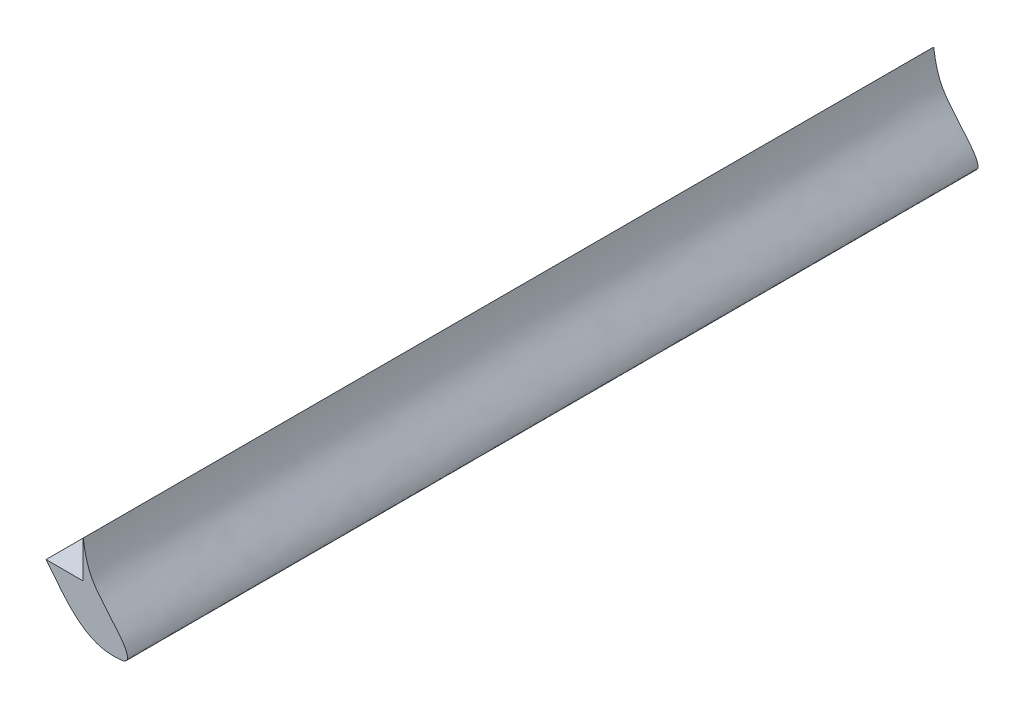
ISO-10303-21;
HEADER;
FILE_DESCRIPTION(('STEP AP214'),'2;1');
FILE_NAME('part.step','',(''),(''),'','','');
FILE_SCHEMA(('AUTOMOTIVE_DESIGN { 1 0 10303 214 1 1 1 1 }'));
ENDSEC;
DATA;
#1=APPLICATION_CONTEXT('core data for automotive mechanical design processes');
#2=APPLICATION_PROTOCOL_DEFINITION('international standard','automotive_design',2000,#1);
#3=PRODUCT_CONTEXT('',#1,'mechanical');
#4=PRODUCT('Part','Part','',(#3));
#5=PRODUCT_RELATED_PRODUCT_CATEGORY('part','',(#4));
#6=PRODUCT_DEFINITION_FORMATION('','',#4);
#7=PRODUCT_DEFINITION_CONTEXT('part definition',#1,'design');
#8=PRODUCT_DEFINITION('design','',#6,#7);
#9=PRODUCT_DEFINITION_SHAPE('','',#8);
#10=(LENGTH_UNIT() NAMED_UNIT(*) SI_UNIT(.MILLI.,.METRE.));
#11=(NAMED_UNIT(*) PLANE_ANGLE_UNIT() SI_UNIT($,.RADIAN.));
#12=(NAMED_UNIT(*) SI_UNIT($,.STERADIAN.) SOLID_ANGLE_UNIT());
#13=UNCERTAINTY_MEASURE_WITH_UNIT(LENGTH_MEASURE(1.E-05),#10,'distance_accuracy_value','');
#14=(GEOMETRIC_REPRESENTATION_CONTEXT(3) GLOBAL_UNCERTAINTY_ASSIGNED_CONTEXT((#13)) GLOBAL_UNIT_ASSIGNED_CONTEXT((#10,
#11,#12)) REPRESENTATION_CONTEXT('',''));
#15=CARTESIAN_POINT('',(0.,0.,0.));
#16=DIRECTION('',(0.,0.,1.));
#17=DIRECTION('',(1.,0.,0.));
#18=AXIS2_PLACEMENT_3D('',#15,#16,#17);
#19=CARTESIAN_POINT('',(0.,0.,-68.58));
#20=DIRECTION('',(0.,1.,0.));
#21=DIRECTION('',(-1.,0.,0.));
#22=AXIS2_PLACEMENT_3D('',#19,#20,#21);
#23=PLANE('',#22);
#24=DIRECTION('',(-1.,0.,0.));
#25=VECTOR('',#24,1.);
#26=CARTESIAN_POINT('',(0.,0.,0.));
#27=LINE('',#26,#25);
#28=CARTESIAN_POINT('',(0.,0.,0.));
#29=VERTEX_POINT('',#28);
#30=CARTESIAN_POINT('',(-3.,0.,0.));
#31=VERTEX_POINT('',#30);
#32=EDGE_CURVE('E123',#29,#31,#27,.T.);
#33=ORIENTED_EDGE('',*,*,#32,.F.);
#34=DIRECTION('',(0.,0.,1.));
#35=VECTOR('',#34,1.);
#36=CARTESIAN_POINT('',(0.,0.,-68.58));
#37=LINE('',#36,#35);
#38=CARTESIAN_POINT('',(0.,0.,-68.58));
#39=VERTEX_POINT('',#38);
#40=EDGE_CURVE('E11',#39,#29,#37,.T.);
#41=ORIENTED_EDGE('',*,*,#40,.F.);
#42=DIRECTION('',(-1.,0.,0.));
#43=VECTOR('',#42,1.);
#44=CARTESIAN_POINT('',(0.,0.,-68.58));
#45=LINE('',#44,#43);
#46=CARTESIAN_POINT('',(-3.,0.,-68.58));
#47=VERTEX_POINT('',#46);
#48=EDGE_CURVE('E91',#39,#47,#45,.T.);
#49=ORIENTED_EDGE('',*,*,#48,.T.);
#50=DIRECTION('',(0.,0.,1.));
#51=VECTOR('',#50,1.);
#52=CARTESIAN_POINT('',(-3.,0.,-68.58));
#53=LINE('',#52,#51);
#54=EDGE_CURVE('E36',#47,#31,#53,.T.);
#55=ORIENTED_EDGE('',*,*,#54,.T.);
#56=EDGE_LOOP('',(#33,#41,#49,#55));
#57=FACE_BOUND('',#56,.T.);
#58=ADVANCED_FACE('F33',(#57),#23,.T.);
#59=CARTESIAN_POINT('',(0.,0.,-68.58));
#60=DIRECTION('',(-1.,0.,0.));
#61=DIRECTION('',(0.,0.,1.));
#62=AXIS2_PLACEMENT_3D('',#59,#60,#61);
#63=PLANE('',#62);
#64=DIRECTION('',(0.,-1.,0.));
#65=VECTOR('',#64,1.);
#66=CARTESIAN_POINT('',(0.,0.,0.));
#67=LINE('',#66,#65);
#68=CARTESIAN_POINT('',(0.,3.,0.));
#69=VERTEX_POINT('',#68);
#70=EDGE_CURVE('E93',#69,#29,#67,.T.);
#71=ORIENTED_EDGE('',*,*,#70,.F.);
#72=DIRECTION('',(0.,0.,1.));
#73=VECTOR('',#72,1.);
#74=CARTESIAN_POINT('',(0.,3.,-68.58));
#75=LINE('',#74,#73);
#76=CARTESIAN_POINT('',(0.,3.,-68.58));
#77=VERTEX_POINT('',#76);
#78=EDGE_CURVE('E42',#77,#69,#75,.T.);
#79=ORIENTED_EDGE('',*,*,#78,.F.);
#80=DIRECTION('',(0.,-1.,0.));
#81=VECTOR('',#80,1.);
#82=CARTESIAN_POINT('',(0.,0.,-68.58));
#83=LINE('',#82,#81);
#84=EDGE_CURVE('E88',#77,#39,#83,.T.);
#85=ORIENTED_EDGE('',*,*,#84,.T.);
#86=ORIENTED_EDGE('',*,*,#40,.T.);
#87=EDGE_LOOP('',(#71,#79,#85,#86));
#88=FACE_BOUND('',#87,.T.);
#89=ADVANCED_FACE('F109',(#88),#63,.T.);
#90=CARTESIAN_POINT('',(2.81361493526314,-4.,-68.58));
#91=CARTESIAN_POINT('',(4.28264407173676,-4.02058624756493,-68.58));
#92=CARTESIAN_POINT('',(1.44122970901893,-0.309933446723973,-68.58));
#93=CARTESIAN_POINT('',(0.338549253182625,0.433022708886823,-68.58));
#94=CARTESIAN_POINT('',(0.,3.,-68.58));
#95=B_SPLINE_CURVE_WITH_KNOTS('',3,(#90,#91,#92,#93,#94),.UNSPECIFIED.,.F.,.F.,(4,1,4),(0.,
0.345394544120581,1.),.UNSPECIFIED.);
#96=DIRECTION('',(0.,0.,1.));
#97=VECTOR('',#96,1.);
#98=SURFACE_OF_LINEAR_EXTRUSION('',#95,#97);
#99=CARTESIAN_POINT('',(2.81361493526314,-4.,0.));
#100=CARTESIAN_POINT('',(4.28264407173676,-4.02058624756493,0.));
#101=CARTESIAN_POINT('',(1.44122970901893,-0.309933446723973,0.));
#102=CARTESIAN_POINT('',(0.338549253182625,0.433022708886823,0.));
#103=CARTESIAN_POINT('',(0.,3.,0.));
#104=B_SPLINE_CURVE_WITH_KNOTS('',3,(#99,#100,#101,#102,#103),.UNSPECIFIED.,.F.,.F.,(4,1,4),(0.,
0.345394544120581,1.),.UNSPECIFIED.);
#105=CARTESIAN_POINT('',(2.81361493526314,-4.,0.));
#106=VERTEX_POINT('',#105);
#107=EDGE_CURVE('E83',#106,#69,#104,.T.);
#108=ORIENTED_EDGE('',*,*,#107,.F.);
#109=DIRECTION('',(0.,0.,1.));
#110=VECTOR('',#109,1.);
#111=CARTESIAN_POINT('',(2.81361493526314,-4.,-68.58));
#112=LINE('',#111,#110);
#113=CARTESIAN_POINT('',(2.81361493526314,-4.,-68.58));
#114=VERTEX_POINT('',#113);
#115=EDGE_CURVE('E78',#114,#106,#112,.T.);
#116=ORIENTED_EDGE('',*,*,#115,.F.);
#117=EDGE_CURVE('E81',#114,#77,#95,.T.);
#118=ORIENTED_EDGE('',*,*,#117,.T.);
#119=ORIENTED_EDGE('',*,*,#78,.T.);
#120=EDGE_LOOP('',(#108,#116,#118,#119));
#121=FACE_BOUND('',#120,.T.);
#122=ADVANCED_FACE('F80',(#121),#98,.T.);
#123=CARTESIAN_POINT('',(-3.,0.,-68.58));
#124=CARTESIAN_POINT('',(-1.92781251142208,-1.30067775903541,-68.58));
#125=CARTESIAN_POINT('',(-0.321687318383388,-3.75576279015845,-68.58));
#126=CARTESIAN_POINT('',(2.21698229694955,-4.06217565668465,-68.58));
#127=CARTESIAN_POINT('',(2.81361493526314,-4.,-68.58));
#128=B_SPLINE_CURVE_WITH_KNOTS('',3,(#123,#124,#125,#126,#127),.UNSPECIFIED.,.F.,.F.,(4,1,4),
(0.,0.755604587981371,1.),.UNSPECIFIED.);
#129=DIRECTION('',(0.,0.,1.));
#130=VECTOR('',#129,1.);
#131=SURFACE_OF_LINEAR_EXTRUSION('',#128,#130);
#132=CARTESIAN_POINT('',(-3.,0.,0.));
#133=CARTESIAN_POINT('',(-1.92781251142208,-1.30067775903541,0.));
#134=CARTESIAN_POINT('',(-0.321687318383388,-3.75576279015845,0.));
#135=CARTESIAN_POINT('',(2.21698229694955,-4.06217565668465,0.));
#136=CARTESIAN_POINT('',(2.81361493526314,-4.,0.));
#137=B_SPLINE_CURVE_WITH_KNOTS('',3,(#132,#133,#134,#135,#136),.UNSPECIFIED.,.F.,.F.,(4,1,4),
(0.,0.755604587981371,1.),.UNSPECIFIED.);
#138=EDGE_CURVE('E125',#31,#106,#137,.T.);
#139=ORIENTED_EDGE('',*,*,#138,.F.);
#140=ORIENTED_EDGE('',*,*,#54,.F.);
#141=EDGE_CURVE('E87',#47,#114,#128,.T.);
#142=ORIENTED_EDGE('',*,*,#141,.T.);
#143=ORIENTED_EDGE('',*,*,#115,.T.);
#144=EDGE_LOOP('',(#139,#140,#142,#143));
#145=FACE_BOUND('',#144,.T.);
#146=ADVANCED_FACE('F90',(#145),#131,.T.);
#147=CARTESIAN_POINT('',(-0.572475157742196,-2.79423661963499,-68.58));
#148=DIRECTION('',(0.,0.,1.));
#149=DIRECTION('',(1.,0.,0.));
#150=AXIS2_PLACEMENT_3D('',#147,#148,#149);
#151=PLANE('',#150);
#152=ORIENTED_EDGE('',*,*,#48,.F.);
#153=ORIENTED_EDGE('',*,*,#84,.F.);
#154=ORIENTED_EDGE('',*,*,#117,.F.);
#155=ORIENTED_EDGE('',*,*,#141,.F.);
#156=EDGE_LOOP('',(#152,#153,#154,#155));
#157=FACE_BOUND('',#156,.T.);
#158=ADVANCED_FACE('F86',(#157),#151,.F.);
#159=CARTESIAN_POINT('',(-0.572475157742196,-2.79423661963499,0.));
#160=DIRECTION('',(0.,0.,1.));
#161=DIRECTION('',(1.,0.,0.));
#162=AXIS2_PLACEMENT_3D('',#159,#160,#161);
#163=PLANE('',#162);
#164=ORIENTED_EDGE('',*,*,#32,.T.);
#165=ORIENTED_EDGE('',*,*,#138,.T.);
#166=ORIENTED_EDGE('',*,*,#107,.T.);
#167=ORIENTED_EDGE('',*,*,#70,.T.);
#168=EDGE_LOOP('',(#164,#165,#166,#167));
#169=FACE_BOUND('',#168,.T.);
#170=ADVANCED_FACE('F112',(#169),#163,.T.);
#171=CLOSED_SHELL('',(#58,#89,#122,#146,#158,#170));
#172=MANIFOLD_SOLID_BREP('B2',#171);
#173=ADVANCED_BREP_SHAPE_REPRESENTATION('',(#18,#172),#14);
#174=SHAPE_DEFINITION_REPRESENTATION(#9,#173);
ENDSEC;
END-ISO-10303-21;
